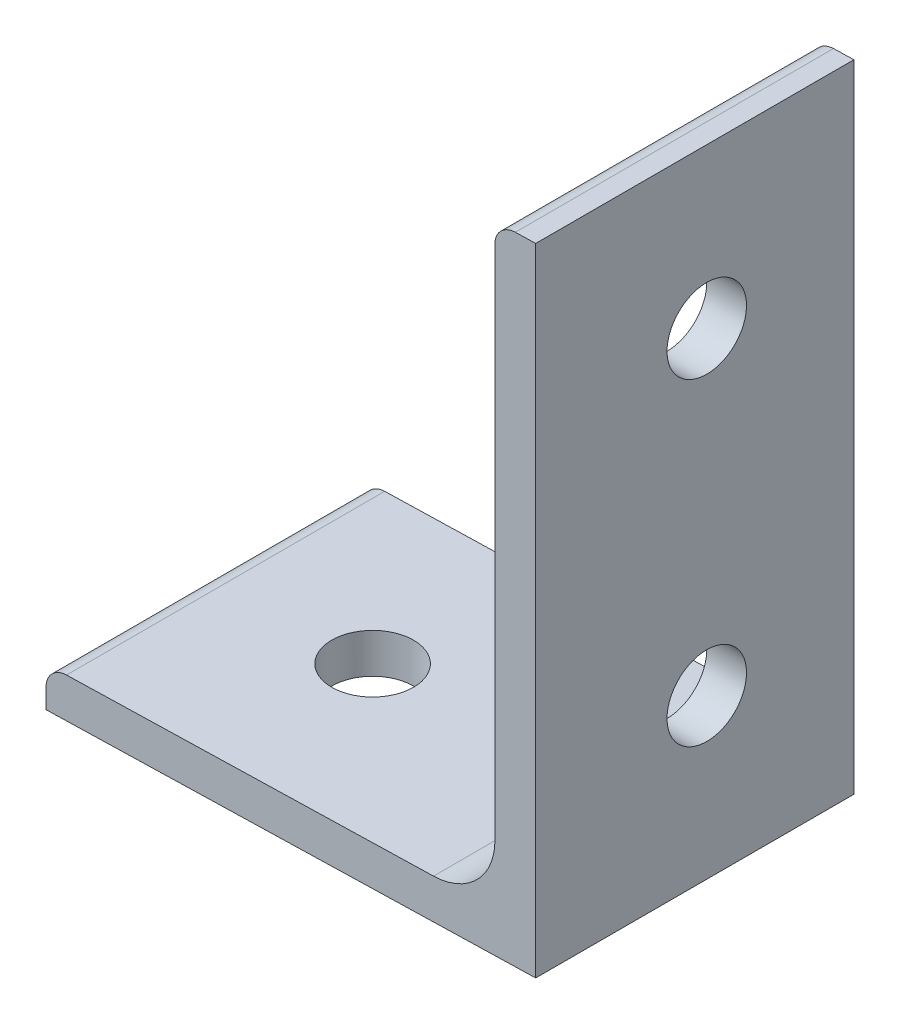
ISO-10303-21;
HEADER;
FILE_DESCRIPTION(('STEP AP214'),'2;1');
FILE_NAME('part.step','',(''),(''),'','','');
FILE_SCHEMA(('AUTOMOTIVE_DESIGN { 1 0 10303 214 1 1 1 1 }'));
ENDSEC;
DATA;
#1=APPLICATION_CONTEXT('core data for automotive mechanical design processes');
#2=APPLICATION_PROTOCOL_DEFINITION('international standard','automotive_design',2000,#1);
#3=PRODUCT_CONTEXT('',#1,'mechanical');
#4=PRODUCT('Part','Part','',(#3));
#5=PRODUCT_RELATED_PRODUCT_CATEGORY('part','',(#4));
#6=PRODUCT_DEFINITION_FORMATION('','',#4);
#7=PRODUCT_DEFINITION_CONTEXT('part definition',#1,'design');
#8=PRODUCT_DEFINITION('design','',#6,#7);
#9=PRODUCT_DEFINITION_SHAPE('','',#8);
#10=(LENGTH_UNIT() NAMED_UNIT(*) SI_UNIT(.MILLI.,.METRE.));
#11=(NAMED_UNIT(*) PLANE_ANGLE_UNIT() SI_UNIT($,.RADIAN.));
#12=(NAMED_UNIT(*) SI_UNIT($,.STERADIAN.) SOLID_ANGLE_UNIT());
#13=UNCERTAINTY_MEASURE_WITH_UNIT(LENGTH_MEASURE(1.E-05),#10,'distance_accuracy_value','');
#14=(GEOMETRIC_REPRESENTATION_CONTEXT(3) GLOBAL_UNCERTAINTY_ASSIGNED_CONTEXT((#13)) GLOBAL_UNIT_ASSIGNED_CONTEXT((#10,
#11,#12)) REPRESENTATION_CONTEXT('',''));
#15=CARTESIAN_POINT('',(0.,0.,0.));
#16=DIRECTION('',(0.,0.,1.));
#17=DIRECTION('',(1.,0.,0.));
#18=AXIS2_PLACEMENT_3D('',#15,#16,#17);
#19=CARTESIAN_POINT('',(11.0998,-17.4498,15.875));
#20=DIRECTION('',(0.,0.,-1.));
#21=DIRECTION('',(-1.,0.,0.));
#22=AXIS2_PLACEMENT_3D('',#19,#20,#21);
#23=CYLINDRICAL_SURFACE('',#22,4.7752);
#24=CARTESIAN_POINT('',(15.875,-17.4498,-7.38948691539076));
#25=CARTESIAN_POINT('',(15.8749607958703,-17.5857111678711,-7.23636728916195));
#26=CARTESIAN_POINT('',(15.8691996849909,-17.7140476477458,-7.07676011712815));
#27=CARTESIAN_POINT('',(15.8497967345363,-17.9544683584301,-6.74636367936128));
#28=CARTESIAN_POINT('',(15.8361614968117,-18.0665661058063,-6.57558388724294));
#29=CARTESIAN_POINT('',(15.8045617726995,-18.2736350085392,-6.22437732001977));
#30=CARTESIAN_POINT('',(15.7865973860279,-18.3686065582862,-6.04395076718932));
#31=CARTESIAN_POINT('',(15.7495425805541,-18.5407600045839,-5.67489280668496));
#32=CARTESIAN_POINT('',(15.7304521193145,-18.6179412301489,-5.48626108986135));
#33=CARTESIAN_POINT('',(15.6967691857035,-18.7436213817966,-5.13128612612312));
#34=CARTESIAN_POINT('',(15.6819325225662,-18.7946903479383,-4.96587074235887));
#35=CARTESIAN_POINT('',(15.6550238870502,-18.8831929373582,-4.63121749717746));
#36=CARTESIAN_POINT('',(15.6429515643681,-18.9206282886737,-4.46198012308084));
#37=CARTESIAN_POINT('',(15.6227910942342,-18.9815035505426,-4.12111181286566));
#38=CARTESIAN_POINT('',(15.61469514375,-19.0049708905553,-3.94948624968054));
#39=CARTESIAN_POINT('',(15.6032507410658,-19.0378086575615,-3.60472523409579));
#40=CARTESIAN_POINT('',(15.5999023688349,-19.0471788470998,-3.43158975631226));
#41=CARTESIAN_POINT('',(15.5982853959638,-19.0517270775053,-3.08510852811338));
#42=CARTESIAN_POINT('',(15.6000167809953,-19.046905158404,-2.91176277829253));
#43=CARTESIAN_POINT('',(15.6083875972335,-19.0231181320052,-2.56616507987638));
#44=CARTESIAN_POINT('',(15.6150271156843,-19.0041527733028,-2.39391315077905));
#45=CARTESIAN_POINT('',(15.6325736391906,-18.9522138991968,-2.05144617658219));
#46=CARTESIAN_POINT('',(15.6434882697233,-18.9192153438454,-1.8812353343889));
#47=CARTESIAN_POINT('',(15.6685023777956,-18.8394888602921,-1.5443108029917));
#48=CARTESIAN_POINT('',(15.6826017995377,-18.7927611726205,-1.37759705257459));
#49=CARTESIAN_POINT('',(15.7124527944421,-18.6863262194501,-1.04994842473229));
#50=CARTESIAN_POINT('',(15.7281908781162,-18.6267211685287,-0.888979051578148));
#51=CARTESIAN_POINT('',(15.7597762892197,-18.494674394576,-0.572372254397139));
#52=CARTESIAN_POINT('',(15.775623634243,-18.4222305554551,-0.416735714382006));
#53=CARTESIAN_POINT('',(15.8055620041383,-18.2651029571149,-0.11208722770826));
#54=CARTESIAN_POINT('',(15.8196573049611,-18.1804501317333,0.036940252604109));
#55=CARTESIAN_POINT('',(15.844163346169,-17.9992544101473,0.327817376701794));
#56=CARTESIAN_POINT('',(15.8545764055646,-17.9027190491873,0.469671489726635));
#57=CARTESIAN_POINT('',(15.8661705537528,-17.7452906054384,0.681961409910588));
#58=CARTESIAN_POINT('',(15.8693951869497,-17.6883913450767,0.755275087871628));
#59=CARTESIAN_POINT('',(15.8738086580742,-17.5714388928702,0.899332815034927));
#60=CARTESIAN_POINT('',(15.8749986832437,-17.5113875614351,0.970078339208201));
#61=CARTESIAN_POINT('',(15.875,-17.4498,1.03948691539076));
#62=B_SPLINE_CURVE_WITH_KNOTS('',3,(#24,#25,#26,#27,#28,#29,#30,#31,#32,#33,#34,#35,#36,#37,#38,
#39,#40,#41,#42,#43,#44,#45,#46,#47,#48,#49,#50,#51,#52,#53,#54,#55,#56,#57,#58,#59,#60,#61),
.UNSPECIFIED.,.F.,.F.,(4,2,2,2,2,2,2,2,2,2,2,2,2,2,2,2,2,2,4),(0.,0.613649372772354,
1.22678499311274,1.83990649206568,2.45305111192113,2.97374489222339,3.49437265248971,
4.01397463607019,4.53358537183239,5.05319464193575,5.57281314850679,6.09336274560457,
6.61390322337106,7.13045448971822,7.64709097337797,8.16244073380394,8.67746535559927,
8.95594344265793,9.23425897565638),.UNSPECIFIED.);
#63=CARTESIAN_POINT('',(15.875,-17.4498,-7.38948691539076));
#64=VERTEX_POINT('',#63);
#65=CARTESIAN_POINT('',(15.875,-17.4498,1.03948691539076));
#66=VERTEX_POINT('',#65);
#67=EDGE_CURVE('E12',#64,#66,#62,.T.);
#68=ORIENTED_EDGE('',*,*,#67,.F.);
#69=DIRECTION('',(0.,0.,-1.));
#70=VECTOR('',#69,1.);
#71=CARTESIAN_POINT('',(15.875,-17.4498,15.875));
#72=LINE('',#71,#70);
#73=CARTESIAN_POINT('',(15.875,-17.4498,-14.8413781368338));
#74=VERTEX_POINT('',#73);
#75=EDGE_CURVE('E128',#64,#74,#72,.T.);
#76=ORIENTED_EDGE('',*,*,#75,.T.);
#77=CARTESIAN_POINT('',(11.0998,-17.4498,-14.7163351241563));
#78=DIRECTION('',(-0.0261769483079492,0.,-0.999657324975555));
#79=DIRECTION('',(0.999657324975555,0.,-0.0261769483079492));
#80=AXIS2_PLACEMENT_3D('',#77,#78,#79);
#81=ELLIPSE('',#80,4.7768369027024,4.7752);
#82=CARTESIAN_POINT('',(11.0998,-22.225,-14.7163351241563));
#83=VERTEX_POINT('',#82);
#84=EDGE_CURVE('E199',#83,#74,#81,.F.);
#85=ORIENTED_EDGE('',*,*,#84,.F.);
#86=DIRECTION('',(0.,0.,-1.));
#87=VECTOR('',#86,1.);
#88=CARTESIAN_POINT('',(11.0998,-22.225,15.875));
#89=LINE('',#88,#87);
#90=CARTESIAN_POINT('',(11.0998,-22.225,10.692371805118));
#91=VERTEX_POINT('',#90);
#92=EDGE_CURVE('E137',#91,#83,#89,.T.);
#93=ORIENTED_EDGE('',*,*,#92,.F.);
#94=CARTESIAN_POINT('',(11.0998,-17.4498,10.692371805118));
#95=DIRECTION('',(0.0261769483079642,0.,0.999657324975555));
#96=DIRECTION('',(0.999657324975555,0.,-0.0261769483079642));
#97=AXIS2_PLACEMENT_3D('',#94,#95,#96);
#98=ELLIPSE('',#97,4.7768369027024,4.7752);
#99=CARTESIAN_POINT('',(15.875,-17.4498,10.5673287924404));
#100=VERTEX_POINT('',#99);
#101=EDGE_CURVE('E205',#100,#91,#98,.F.);
#102=ORIENTED_EDGE('',*,*,#101,.F.);
#103=EDGE_CURVE('E131',#100,#66,#72,.T.);
#104=ORIENTED_EDGE('',*,*,#103,.T.);
#105=EDGE_LOOP('',(#68,#76,#85,#93,#102,#104));
#106=FACE_BOUND('',#105,.T.);
#107=ADVANCED_FACE('F40',(#106),#23,.F.);
#108=CARTESIAN_POINT('',(-19.05,-23.8125,15.875));
#109=DIRECTION('',(1.,0.,0.));
#110=DIRECTION('',(0.,0.,-1.));
#111=AXIS2_PLACEMENT_3D('',#108,#109,#110);
#112=PLANE('',#111);
#113=DIRECTION('',(0.,-1.,0.));
#114=VECTOR('',#113,1.);
#115=CARTESIAN_POINT('',(-19.0500000000003,25.4,11.4818721032475));
#116=LINE('',#115,#114);
#117=CARTESIAN_POINT('',(-19.05,-23.8125,11.4818721032474));
#118=VERTEX_POINT('',#117);
#119=CARTESIAN_POINT('',(-19.0500000000003,-25.4,11.4818721032475));
#120=VERTEX_POINT('',#119);
#121=EDGE_CURVE('E188',#118,#120,#116,.T.);
#122=ORIENTED_EDGE('',*,*,#121,.F.);
#123=DIRECTION('',(0.,0.,-1.));
#124=VECTOR('',#123,1.);
#125=CARTESIAN_POINT('',(-19.05,-23.8125,15.875));
#126=LINE('',#125,#124);
#127=CARTESIAN_POINT('',(-19.05,-23.8125,-13.9268348260273));
#128=VERTEX_POINT('',#127);
#129=EDGE_CURVE('E166',#118,#128,#126,.T.);
#130=ORIENTED_EDGE('',*,*,#129,.T.);
#131=DIRECTION('',(0.,-1.,0.));
#132=VECTOR('',#131,1.);
#133=CARTESIAN_POINT('',(-19.0500000000003,25.4,-13.9268348260273));
#134=LINE('',#133,#132);
#135=CARTESIAN_POINT('',(-19.0500000000003,-25.4,-13.9268348260273));
#136=VERTEX_POINT('',#135);
#137=EDGE_CURVE('E184',#128,#136,#134,.T.);
#138=ORIENTED_EDGE('',*,*,#137,.T.);
#139=DIRECTION('',(0.,0.,-1.));
#140=VECTOR('',#139,1.);
#141=CARTESIAN_POINT('',(-19.05,-25.4,15.875));
#142=LINE('',#141,#140);
#143=EDGE_CURVE('E155',#120,#136,#142,.T.);
#144=ORIENTED_EDGE('',*,*,#143,.F.);
#145=EDGE_LOOP('',(#122,#130,#138,#144));
#146=FACE_BOUND('',#145,.T.);
#147=ADVANCED_FACE('F42',(#146),#112,.F.);
#148=CARTESIAN_POINT('',(-19.05,-25.4,15.875));
#149=DIRECTION('',(0.,1.,0.));
#150=DIRECTION('',(-1.,0.,0.));
#151=AXIS2_PLACEMENT_3D('',#148,#149,#150);
#152=PLANE('',#151);
#153=CARTESIAN_POINT('',(-6.02190472929899,-25.4,-1.56363404234756));
#154=DIRECTION('',(0.,-1.,0.));
#155=DIRECTION('',(0.,0.,-1.));
#156=AXIS2_PLACEMENT_3D('',#153,#154,#155);
#157=CIRCLE('',#156,3.26389999999999);
#158=CARTESIAN_POINT('',(-6.02190472929899,-25.4,-4.82753404234755));
#159=VERTEX_POINT('',#158);
#160=EDGE_CURVE('E124',#159,#159,#157,.T.);
#161=ORIENTED_EDGE('',*,*,#160,.F.);
#162=EDGE_LOOP('',(#161));
#163=FACE_BOUND('',#162,.T.);
#164=DIRECTION('',(-0.999657324975555,0.,0.0261769483079642));
#165=VECTOR('',#164,1.);
#166=CARTESIAN_POINT('',(-19.0500000000003,-25.4,11.4818721032475));
#167=LINE('',#166,#165);
#168=CARTESIAN_POINT('',(19.05,-25.4,10.484188491458));
#169=VERTEX_POINT('',#168);
#170=EDGE_CURVE('E174',#169,#120,#167,.T.);
#171=ORIENTED_EDGE('',*,*,#170,.T.);
#172=ORIENTED_EDGE('',*,*,#143,.T.);
#173=DIRECTION('',(0.999657324975555,0.,-0.0261769483079492));
#174=VECTOR('',#173,1.);
#175=CARTESIAN_POINT('',(-19.0500000000003,-25.4,-13.9268348260273));
#176=LINE('',#175,#174);
#177=CARTESIAN_POINT('',(19.05,-25.4,-14.9245184378162));
#178=VERTEX_POINT('',#177);
#179=EDGE_CURVE('E170',#136,#178,#176,.T.);
#180=ORIENTED_EDGE('',*,*,#179,.T.);
#181=DIRECTION('',(0.,0.,-1.));
#182=VECTOR('',#181,1.);
#183=CARTESIAN_POINT('',(19.05,-25.4,15.875));
#184=LINE('',#183,#182);
#185=EDGE_CURVE('E152',#169,#178,#184,.T.);
#186=ORIENTED_EDGE('',*,*,#185,.F.);
#187=EDGE_LOOP('',(#171,#172,#180,#186));
#188=FACE_BOUND('',#187,.T.);
#189=ADVANCED_FACE('F246',(#163,#188),#152,.F.);
#190=CARTESIAN_POINT('',(19.05,-25.4,15.875));
#191=DIRECTION('',(-1.,0.,0.));
#192=DIRECTION('',(0.,-1.,0.));
#193=AXIS2_PLACEMENT_3D('',#190,#191,#192);
#194=PLANE('',#193);
#195=CARTESIAN_POINT('',(19.05,12.7,-3.175));
#196=DIRECTION('',(1.,0.,0.));
#197=DIRECTION('',(0.,1.,0.));
#198=AXIS2_PLACEMENT_3D('',#195,#196,#197);
#199=CIRCLE('',#198,3.175);
#200=CARTESIAN_POINT('',(19.05,15.875,-3.175));
#201=VERTEX_POINT('',#200);
#202=EDGE_CURVE('E163',#201,#201,#199,.T.);
#203=ORIENTED_EDGE('',*,*,#202,.F.);
#204=EDGE_LOOP('',(#203));
#205=FACE_BOUND('',#204,.T.);
#206=CARTESIAN_POINT('',(19.05,-12.7,-3.175));
#207=DIRECTION('',(1.,0.,0.));
#208=DIRECTION('',(0.,1.,0.));
#209=AXIS2_PLACEMENT_3D('',#206,#207,#208);
#210=CIRCLE('',#209,3.175);
#211=CARTESIAN_POINT('',(19.05,-9.525,-3.175));
#212=VERTEX_POINT('',#211);
#213=EDGE_CURVE('E211',#212,#212,#210,.T.);
#214=ORIENTED_EDGE('',*,*,#213,.F.);
#215=EDGE_LOOP('',(#214));
#216=FACE_BOUND('',#215,.T.);
#217=DIRECTION('',(0.,-1.,0.));
#218=VECTOR('',#217,1.);
#219=CARTESIAN_POINT('',(19.05,25.4,10.484188491458));
#220=LINE('',#219,#218);
#221=CARTESIAN_POINT('',(19.05,25.4,10.484188491458));
#222=VERTEX_POINT('',#221);
#223=EDGE_CURVE('E191',#222,#169,#220,.T.);
#224=ORIENTED_EDGE('',*,*,#223,.T.);
#225=ORIENTED_EDGE('',*,*,#185,.T.);
#226=DIRECTION('',(0.,-1.,0.));
#227=VECTOR('',#226,1.);
#228=CARTESIAN_POINT('',(19.05,25.4,-14.9245184378162));
#229=LINE('',#228,#227);
#230=CARTESIAN_POINT('',(19.05,25.4,-14.9245184378162));
#231=VERTEX_POINT('',#230);
#232=EDGE_CURVE('E194',#231,#178,#229,.T.);
#233=ORIENTED_EDGE('',*,*,#232,.F.);
#234=DIRECTION('',(0.,0.,-1.));
#235=VECTOR('',#234,1.);
#236=CARTESIAN_POINT('',(19.05,25.4,15.875));
#237=LINE('',#236,#235);
#238=EDGE_CURVE('E149',#222,#231,#237,.T.);
#239=ORIENTED_EDGE('',*,*,#238,.F.);
#240=EDGE_LOOP('',(#224,#225,#233,#239));
#241=FACE_BOUND('',#240,.T.);
#242=ADVANCED_FACE('F243',(#205,#216,#241),#194,.F.);
#243=CARTESIAN_POINT('',(17.4625,25.4,15.875));
#244=DIRECTION('',(0.,-1.,0.));
#245=DIRECTION('',(1.,0.,0.));
#246=AXIS2_PLACEMENT_3D('',#243,#244,#245);
#247=PLANE('',#246);
#248=DIRECTION('',(-0.999657324975555,0.,0.0261769483079642));
#249=VECTOR('',#248,1.);
#250=CARTESIAN_POINT('',(-19.0500000000003,25.4,11.4818721032475));
#251=LINE('',#250,#249);
#252=CARTESIAN_POINT('',(17.4625,25.4,10.5257586419492));
#253=VERTEX_POINT('',#252);
#254=EDGE_CURVE('E183',#222,#253,#251,.T.);
#255=ORIENTED_EDGE('',*,*,#254,.F.);
#256=ORIENTED_EDGE('',*,*,#238,.T.);
#257=DIRECTION('',(0.999657324975555,0.,-0.0261769483079492));
#258=VECTOR('',#257,1.);
#259=CARTESIAN_POINT('',(-19.0500000000003,25.4,-13.9268348260273));
#260=LINE('',#259,#258);
#261=CARTESIAN_POINT('',(17.4625,25.4,-14.882948287325));
#262=VERTEX_POINT('',#261);
#263=EDGE_CURVE('E181',#262,#231,#260,.T.);
#264=ORIENTED_EDGE('',*,*,#263,.F.);
#265=DIRECTION('',(0.,0.,-1.));
#266=VECTOR('',#265,1.);
#267=CARTESIAN_POINT('',(17.4625,25.4,15.875));
#268=LINE('',#267,#266);
#269=EDGE_CURVE('E146',#253,#262,#268,.T.);
#270=ORIENTED_EDGE('',*,*,#269,.F.);
#271=EDGE_LOOP('',(#255,#256,#264,#270));
#272=FACE_BOUND('',#271,.T.);
#273=ADVANCED_FACE('F240',(#272),#247,.F.);
#274=CARTESIAN_POINT('',(17.4625,23.8125,15.875));
#275=DIRECTION('',(0.,0.,-1.));
#276=DIRECTION('',(-1.,0.,0.));
#277=AXIS2_PLACEMENT_3D('',#274,#275,#276);
#278=CYLINDRICAL_SURFACE('',#277,1.5875);
#279=CARTESIAN_POINT('',(17.4625,23.8125,10.5257586419492));
#280=DIRECTION('',(0.0261769483079642,0.,0.999657324975555));
#281=DIRECTION('',(0.999657324975555,0.,-0.0261769483079642));
#282=AXIS2_PLACEMENT_3D('',#279,#280,#281);
#283=ELLIPSE('',#282,1.58804418307925,1.5875);
#284=CARTESIAN_POINT('',(15.875,23.8125,10.5673287924404));
#285=VERTEX_POINT('',#284);
#286=EDGE_CURVE('E209',#253,#285,#283,.T.);
#287=ORIENTED_EDGE('',*,*,#286,.F.);
#288=ORIENTED_EDGE('',*,*,#269,.T.);
#289=CARTESIAN_POINT('',(17.4625,23.8125,-14.882948287325));
#290=DIRECTION('',(-0.0261769483079492,0.,-0.999657324975555));
#291=DIRECTION('',(0.999657324975555,0.,-0.0261769483079492));
#292=AXIS2_PLACEMENT_3D('',#289,#290,#291);
#293=ELLIPSE('',#292,1.58804418307925,1.5875);
#294=CARTESIAN_POINT('',(15.875,23.8125,-14.8413781368338));
#295=VERTEX_POINT('',#294);
#296=EDGE_CURVE('E202',#295,#262,#293,.T.);
#297=ORIENTED_EDGE('',*,*,#296,.F.);
#298=DIRECTION('',(0.,0.,-1.));
#299=VECTOR('',#298,1.);
#300=CARTESIAN_POINT('',(15.875,23.8125,15.875));
#301=LINE('',#300,#299);
#302=EDGE_CURVE('E139',#285,#295,#301,.T.);
#303=ORIENTED_EDGE('',*,*,#302,.F.);
#304=EDGE_LOOP('',(#287,#288,#297,#303));
#305=FACE_BOUND('',#304,.T.);
#306=ADVANCED_FACE('F234',(#305),#278,.T.);
#307=CARTESIAN_POINT('',(15.875,23.8125,15.875));
#308=DIRECTION('',(1.,0.,0.));
#309=DIRECTION('',(0.,1.,0.));
#310=AXIS2_PLACEMENT_3D('',#307,#308,#309);
#311=PLANE('',#310);
#312=ORIENTED_EDGE('',*,*,#75,.F.);
#313=CARTESIAN_POINT('',(15.875,-12.7,-3.175));
#314=DIRECTION('',(-1.,0.,0.));
#315=DIRECTION('',(0.,-1.,0.));
#316=AXIS2_PLACEMENT_3D('',#313,#314,#315);
#317=CIRCLE('',#316,6.35);
#318=EDGE_CURVE('E61',#64,#66,#317,.T.);
#319=ORIENTED_EDGE('',*,*,#318,.T.);
#320=ORIENTED_EDGE('',*,*,#103,.F.);
#321=DIRECTION('',(0.,-1.,0.));
#322=VECTOR('',#321,1.);
#323=CARTESIAN_POINT('',(15.875,23.8125,10.5673287924404));
#324=LINE('',#323,#322);
#325=EDGE_CURVE('E207',#285,#100,#324,.T.);
#326=ORIENTED_EDGE('',*,*,#325,.F.);
#327=ORIENTED_EDGE('',*,*,#302,.T.);
#328=DIRECTION('',(0.,1.,0.));
#329=VECTOR('',#328,1.);
#330=CARTESIAN_POINT('',(15.875,23.8125,-14.8413781368338));
#331=LINE('',#330,#329);
#332=EDGE_CURVE('E136',#74,#295,#331,.T.);
#333=ORIENTED_EDGE('',*,*,#332,.F.);
#334=EDGE_LOOP('',(#312,#319,#320,#326,#327,#333));
#335=FACE_BOUND('',#334,.T.);
#336=CARTESIAN_POINT('',(15.875,12.7,-3.175));
#337=DIRECTION('',(1.,0.,0.));
#338=DIRECTION('',(0.,1.,0.));
#339=AXIS2_PLACEMENT_3D('',#336,#337,#338);
#340=CIRCLE('',#339,3.175);
#341=CARTESIAN_POINT('',(15.875,15.875,-3.175));
#342=VERTEX_POINT('',#341);
#343=EDGE_CURVE('E162',#342,#342,#340,.T.);
#344=ORIENTED_EDGE('',*,*,#343,.T.);
#345=EDGE_LOOP('',(#344));
#346=FACE_BOUND('',#345,.T.);
#347=CARTESIAN_POINT('',(15.875,-12.7,-3.175));
#348=DIRECTION('',(1.,0.,0.));
#349=DIRECTION('',(0.,1.,0.));
#350=AXIS2_PLACEMENT_3D('',#347,#348,#349);
#351=CIRCLE('',#350,3.175);
#352=CARTESIAN_POINT('',(15.875,-9.525,-3.175));
#353=VERTEX_POINT('',#352);
#354=EDGE_CURVE('E159',#353,#353,#351,.T.);
#355=ORIENTED_EDGE('',*,*,#354,.T.);
#356=EDGE_LOOP('',(#355));
#357=FACE_BOUND('',#356,.T.);
#358=ADVANCED_FACE('F133',(#335,#346,#357),#311,.F.);
#359=CARTESIAN_POINT('',(11.0998,-22.225,15.875));
#360=DIRECTION('',(0.,-1.,0.));
#361=DIRECTION('',(1.,0.,0.));
#362=AXIS2_PLACEMENT_3D('',#359,#360,#361);
#363=PLANE('',#362);
#364=CARTESIAN_POINT('',(-6.02190472929899,-22.225,-1.56363404234756));
#365=DIRECTION('',(0.,-1.,0.));
#366=DIRECTION('',(1.,0.,0.));
#367=AXIS2_PLACEMENT_3D('',#364,#365,#366);
#368=CIRCLE('',#367,3.26389999999999);
#369=CARTESIAN_POINT('',(-2.758004729299,-22.225,-1.56363404234756));
#370=VERTEX_POINT('',#369);
#371=EDGE_CURVE('E168',#370,#370,#368,.T.);
#372=ORIENTED_EDGE('',*,*,#371,.T.);
#373=EDGE_LOOP('',(#372));
#374=FACE_BOUND('',#373,.T.);
#375=DIRECTION('',(-0.999657324975555,0.,0.0261769483079642));
#376=VECTOR('',#375,1.);
#377=CARTESIAN_POINT('',(10.9641810987841,-22.225,10.6959231110286));
#378=LINE('',#377,#376);
#379=CARTESIAN_POINT('',(-17.4625,-22.225,11.4403019527562));
#380=VERTEX_POINT('',#379);
#381=EDGE_CURVE('E68',#91,#380,#378,.T.);
#382=ORIENTED_EDGE('',*,*,#381,.F.);
#383=ORIENTED_EDGE('',*,*,#92,.T.);
#384=DIRECTION('',(0.999657324975555,0.,-0.0261769483079492));
#385=VECTOR('',#384,1.);
#386=CARTESIAN_POINT('',(10.2992866117621,-22.225,-14.6953729433567));
#387=LINE('',#386,#385);
#388=CARTESIAN_POINT('',(-17.4625,-22.225,-13.9684049765185));
#389=VERTEX_POINT('',#388);
#390=EDGE_CURVE('E190',#389,#83,#387,.T.);
#391=ORIENTED_EDGE('',*,*,#390,.F.);
#392=DIRECTION('',(0.,0.,-1.));
#393=VECTOR('',#392,1.);
#394=CARTESIAN_POINT('',(-17.4625,-22.225,15.875));
#395=LINE('',#394,#393);
#396=EDGE_CURVE('E141',#380,#389,#395,.T.);
#397=ORIENTED_EDGE('',*,*,#396,.F.);
#398=EDGE_LOOP('',(#382,#383,#391,#397));
#399=FACE_BOUND('',#398,.T.);
#400=ADVANCED_FACE('F225',(#374,#399),#363,.F.);
#401=CARTESIAN_POINT('',(-17.4625,-23.8125,15.875));
#402=DIRECTION('',(0.,0.,-1.));
#403=DIRECTION('',(-1.,0.,0.));
#404=AXIS2_PLACEMENT_3D('',#401,#402,#403);
#405=CYLINDRICAL_SURFACE('',#404,1.5875);
#406=CARTESIAN_POINT('',(-17.4625,-23.8125,11.4403019527562));
#407=DIRECTION('',(0.0261769483079642,0.,0.999657324975555));
#408=DIRECTION('',(0.999657324975555,0.,-0.0261769483079642));
#409=AXIS2_PLACEMENT_3D('',#406,#407,#408);
#410=ELLIPSE('',#409,1.58804418307926,1.5875);
#411=EDGE_CURVE('E54',#380,#118,#410,.T.);
#412=ORIENTED_EDGE('',*,*,#411,.F.);
#413=ORIENTED_EDGE('',*,*,#396,.T.);
#414=CARTESIAN_POINT('',(-17.4625,-23.8125,-13.9684049765185));
#415=DIRECTION('',(-0.0261769483079492,0.,-0.999657324975555));
#416=DIRECTION('',(0.999657324975555,0.,-0.0261769483079492));
#417=AXIS2_PLACEMENT_3D('',#414,#415,#416);
#418=ELLIPSE('',#417,1.58804418307925,1.5875);
#419=EDGE_CURVE('E158',#128,#389,#418,.T.);
#420=ORIENTED_EDGE('',*,*,#419,.F.);
#421=ORIENTED_EDGE('',*,*,#129,.F.);
#422=EDGE_LOOP('',(#412,#413,#420,#421));
#423=FACE_BOUND('',#422,.T.);
#424=ADVANCED_FACE('F221',(#423),#405,.T.);
#425=CARTESIAN_POINT('',(-19.05,-12.7,-3.175));
#426=DIRECTION('',(1.,0.,0.));
#427=DIRECTION('',(0.,1.,0.));
#428=AXIS2_PLACEMENT_3D('',#425,#426,#427);
#429=CYLINDRICAL_SURFACE('',#428,3.175);
#430=CARTESIAN_POINT('',(19.05,-9.525,-3.175));
#431=CARTESIAN_POINT('',(19.0169270833333,-9.525,-3.175));
#432=CARTESIAN_POINT('',(18.9838541666667,-9.525,-3.175));
#433=CARTESIAN_POINT('',(18.9177083333333,-9.525,-3.175));
#434=CARTESIAN_POINT('',(18.8846354166667,-9.525,-3.175));
#435=CARTESIAN_POINT('',(18.8184895833333,-9.525,-3.175));
#436=CARTESIAN_POINT('',(18.7854166666667,-9.525,-3.175));
#437=CARTESIAN_POINT('',(18.7192708333333,-9.525,-3.175));
#438=CARTESIAN_POINT('',(18.6861979166667,-9.525,-3.175));
#439=CARTESIAN_POINT('',(18.6200520833333,-9.525,-3.175));
#440=CARTESIAN_POINT('',(18.5869791666667,-9.525,-3.175));
#441=CARTESIAN_POINT('',(18.5208333333333,-9.525,-3.175));
#442=CARTESIAN_POINT('',(18.4877604166667,-9.525,-3.175));
#443=CARTESIAN_POINT('',(18.4216145833333,-9.525,-3.175));
#444=CARTESIAN_POINT('',(18.3885416666667,-9.525,-3.175));
#445=CARTESIAN_POINT('',(18.3223958333333,-9.525,-3.175));
#446=CARTESIAN_POINT('',(18.2893229166667,-9.525,-3.175));
#447=CARTESIAN_POINT('',(18.2231770833333,-9.525,-3.175));
#448=CARTESIAN_POINT('',(18.1901041666667,-9.525,-3.175));
#449=CARTESIAN_POINT('',(18.1239583333333,-9.525,-3.175));
#450=CARTESIAN_POINT('',(18.0908854166667,-9.525,-3.175));
#451=CARTESIAN_POINT('',(18.0247395833333,-9.525,-3.175));
#452=CARTESIAN_POINT('',(17.9916666666667,-9.525,-3.175));
#453=CARTESIAN_POINT('',(17.9255208333333,-9.525,-3.175));
#454=CARTESIAN_POINT('',(17.8924479166667,-9.525,-3.175));
#455=CARTESIAN_POINT('',(17.8263020833333,-9.525,-3.175));
#456=CARTESIAN_POINT('',(17.7932291666667,-9.525,-3.175));
#457=CARTESIAN_POINT('',(17.7270833333333,-9.525,-3.175));
#458=CARTESIAN_POINT('',(17.6940104166667,-9.525,-3.175));
#459=CARTESIAN_POINT('',(17.6278645833333,-9.525,-3.175));
#460=CARTESIAN_POINT('',(17.5947916666667,-9.525,-3.175));
#461=CARTESIAN_POINT('',(17.5286458333333,-9.525,-3.175));
#462=CARTESIAN_POINT('',(17.4955729166667,-9.525,-3.175));
#463=CARTESIAN_POINT('',(17.4294270833333,-9.525,-3.175));
#464=CARTESIAN_POINT('',(17.3963541666667,-9.525,-3.175));
#465=CARTESIAN_POINT('',(17.3302083333333,-9.525,-3.175));
#466=CARTESIAN_POINT('',(17.2971354166667,-9.525,-3.175));
#467=CARTESIAN_POINT('',(17.2309895833333,-9.525,-3.175));
#468=CARTESIAN_POINT('',(17.1979166666667,-9.525,-3.175));
#469=CARTESIAN_POINT('',(17.1317708333333,-9.525,-3.175));
#470=CARTESIAN_POINT('',(17.0986979166667,-9.525,-3.175));
#471=CARTESIAN_POINT('',(17.0325520833333,-9.525,-3.175));
#472=CARTESIAN_POINT('',(16.9994791666667,-9.525,-3.175));
#473=CARTESIAN_POINT('',(16.9333333333333,-9.525,-3.175));
#474=CARTESIAN_POINT('',(16.9002604166667,-9.525,-3.175));
#475=CARTESIAN_POINT('',(16.8341145833333,-9.525,-3.175));
#476=CARTESIAN_POINT('',(16.8010416666667,-9.525,-3.175));
#477=CARTESIAN_POINT('',(16.7348958333333,-9.525,-3.175));
#478=CARTESIAN_POINT('',(16.7018229166667,-9.525,-3.175));
#479=CARTESIAN_POINT('',(16.6356770833333,-9.525,-3.175));
#480=CARTESIAN_POINT('',(16.6026041666667,-9.525,-3.175));
#481=CARTESIAN_POINT('',(16.5364583333333,-9.525,-3.175));
#482=CARTESIAN_POINT('',(16.5033854166667,-9.525,-3.175));
#483=CARTESIAN_POINT('',(16.4372395833333,-9.525,-3.175));
#484=CARTESIAN_POINT('',(16.4041666666667,-9.525,-3.175));
#485=CARTESIAN_POINT('',(16.3380208333333,-9.525,-3.175));
#486=CARTESIAN_POINT('',(16.3049479166667,-9.525,-3.175));
#487=CARTESIAN_POINT('',(16.2388020833333,-9.525,-3.175));
#488=CARTESIAN_POINT('',(16.2057291666667,-9.525,-3.175));
#489=CARTESIAN_POINT('',(16.1395833333333,-9.525,-3.175));
#490=CARTESIAN_POINT('',(16.1065104166667,-9.525,-3.175));
#491=CARTESIAN_POINT('',(16.0403645833333,-9.525,-3.175));
#492=CARTESIAN_POINT('',(16.0072916666667,-9.525,-3.175));
#493=CARTESIAN_POINT('',(15.9411458333333,-9.525,-3.175));
#494=CARTESIAN_POINT('',(15.9080729166667,-9.525,-3.175));
#495=CARTESIAN_POINT('',(15.875,-9.525,-3.175));
#496=B_SPLINE_CURVE_WITH_KNOTS('',3,(#430,#431,#432,#433,#434,#435,#436,#437,#438,#439,#440,
#441,#442,#443,#444,#445,#446,#447,#448,#449,#450,#451,#452,#453,#454,#455,#456,#457,#458,#459,
#460,#461,#462,#463,#464,#465,#466,#467,#468,#469,#470,#471,#472,#473,#474,#475,#476,#477,#478,
#479,#480,#481,#482,#483,#484,#485,#486,#487,#488,#489,#490,#491,#492,#493,#494,#495),
.UNSPECIFIED.,.F.,.F.,(4,2,2,2,2,2,2,2,2,2,2,2,2,2,2,2,2,2,2,2,2,2,2,2,2,2,2,2,2,2,2,2,4),(0.,
0.0992187499999977,0.198437500000002,0.29765625,0.396875000000005,0.496093750000003,0.5953125,
0.694531250000005,0.793750000000003,0.892968750000001,0.992187500000005,1.09140625,1.190625,
1.28984375000001,1.3890625,1.48828125000001,1.58750000000001,1.68671875,1.78593750000001,
1.88515625000001,1.98437500000001,2.08359375000001,2.18281250000001,2.28203125000001,
2.38125000000001,2.48046875000001,2.57968750000001,2.67890625000001,2.77812500000001,
2.87734375000001,2.97656250000001,3.07578125000001,3.17500000000001),.UNSPECIFIED.);
#497=EDGE_CURVE('BSEAM312',#212,#353,#496,.T.);
#498=ORIENTED_EDGE('',*,*,#213,.T.);
#499=ORIENTED_EDGE('',*,*,#354,.F.);
#500=ORIENTED_EDGE('',*,*,#497,.T.);
#501=ORIENTED_EDGE('',*,*,#497,.F.);
#502=EDGE_LOOP('',(#498,#500,#499,#501));
#503=FACE_BOUND('',#502,.T.);
#504=ADVANCED_FACE('F312',(#503),#429,.F.);
#505=CARTESIAN_POINT('',(-19.05,12.7,-3.175));
#506=DIRECTION('',(1.,0.,0.));
#507=DIRECTION('',(0.,1.,0.));
#508=AXIS2_PLACEMENT_3D('',#505,#506,#507);
#509=CYLINDRICAL_SURFACE('',#508,3.175);
#510=CARTESIAN_POINT('',(19.05,15.875,-3.175));
#511=CARTESIAN_POINT('',(19.0169270833333,15.875,-3.175));
#512=CARTESIAN_POINT('',(18.9838541666667,15.875,-3.175));
#513=CARTESIAN_POINT('',(18.9177083333333,15.875,-3.175));
#514=CARTESIAN_POINT('',(18.8846354166667,15.875,-3.175));
#515=CARTESIAN_POINT('',(18.8184895833333,15.875,-3.175));
#516=CARTESIAN_POINT('',(18.7854166666667,15.875,-3.175));
#517=CARTESIAN_POINT('',(18.7192708333333,15.875,-3.175));
#518=CARTESIAN_POINT('',(18.6861979166667,15.875,-3.175));
#519=CARTESIAN_POINT('',(18.6200520833333,15.875,-3.175));
#520=CARTESIAN_POINT('',(18.5869791666667,15.875,-3.175));
#521=CARTESIAN_POINT('',(18.5208333333333,15.875,-3.175));
#522=CARTESIAN_POINT('',(18.4877604166667,15.875,-3.175));
#523=CARTESIAN_POINT('',(18.4216145833333,15.875,-3.175));
#524=CARTESIAN_POINT('',(18.3885416666667,15.875,-3.175));
#525=CARTESIAN_POINT('',(18.3223958333333,15.875,-3.175));
#526=CARTESIAN_POINT('',(18.2893229166667,15.875,-3.175));
#527=CARTESIAN_POINT('',(18.2231770833333,15.875,-3.175));
#528=CARTESIAN_POINT('',(18.1901041666667,15.875,-3.175));
#529=CARTESIAN_POINT('',(18.1239583333333,15.875,-3.175));
#530=CARTESIAN_POINT('',(18.0908854166667,15.875,-3.175));
#531=CARTESIAN_POINT('',(18.0247395833333,15.875,-3.175));
#532=CARTESIAN_POINT('',(17.9916666666667,15.875,-3.175));
#533=CARTESIAN_POINT('',(17.9255208333333,15.875,-3.175));
#534=CARTESIAN_POINT('',(17.8924479166667,15.875,-3.175));
#535=CARTESIAN_POINT('',(17.8263020833333,15.875,-3.175));
#536=CARTESIAN_POINT('',(17.7932291666667,15.875,-3.175));
#537=CARTESIAN_POINT('',(17.7270833333333,15.875,-3.175));
#538=CARTESIAN_POINT('',(17.6940104166667,15.875,-3.175));
#539=CARTESIAN_POINT('',(17.6278645833333,15.875,-3.175));
#540=CARTESIAN_POINT('',(17.5947916666667,15.875,-3.175));
#541=CARTESIAN_POINT('',(17.5286458333333,15.875,-3.175));
#542=CARTESIAN_POINT('',(17.4955729166667,15.875,-3.175));
#543=CARTESIAN_POINT('',(17.4294270833333,15.875,-3.175));
#544=CARTESIAN_POINT('',(17.3963541666667,15.875,-3.175));
#545=CARTESIAN_POINT('',(17.3302083333333,15.875,-3.175));
#546=CARTESIAN_POINT('',(17.2971354166667,15.875,-3.175));
#547=CARTESIAN_POINT('',(17.2309895833333,15.875,-3.175));
#548=CARTESIAN_POINT('',(17.1979166666667,15.875,-3.175));
#549=CARTESIAN_POINT('',(17.1317708333333,15.875,-3.175));
#550=CARTESIAN_POINT('',(17.0986979166667,15.875,-3.175));
#551=CARTESIAN_POINT('',(17.0325520833333,15.875,-3.175));
#552=CARTESIAN_POINT('',(16.9994791666667,15.875,-3.175));
#553=CARTESIAN_POINT('',(16.9333333333333,15.875,-3.175));
#554=CARTESIAN_POINT('',(16.9002604166667,15.875,-3.175));
#555=CARTESIAN_POINT('',(16.8341145833333,15.875,-3.175));
#556=CARTESIAN_POINT('',(16.8010416666667,15.875,-3.175));
#557=CARTESIAN_POINT('',(16.7348958333333,15.875,-3.175));
#558=CARTESIAN_POINT('',(16.7018229166667,15.875,-3.175));
#559=CARTESIAN_POINT('',(16.6356770833333,15.875,-3.175));
#560=CARTESIAN_POINT('',(16.6026041666667,15.875,-3.175));
#561=CARTESIAN_POINT('',(16.5364583333333,15.875,-3.175));
#562=CARTESIAN_POINT('',(16.5033854166667,15.875,-3.175));
#563=CARTESIAN_POINT('',(16.4372395833333,15.875,-3.175));
#564=CARTESIAN_POINT('',(16.4041666666667,15.875,-3.175));
#565=CARTESIAN_POINT('',(16.3380208333333,15.875,-3.175));
#566=CARTESIAN_POINT('',(16.3049479166667,15.875,-3.175));
#567=CARTESIAN_POINT('',(16.2388020833333,15.875,-3.175));
#568=CARTESIAN_POINT('',(16.2057291666667,15.875,-3.175));
#569=CARTESIAN_POINT('',(16.1395833333333,15.875,-3.175));
#570=CARTESIAN_POINT('',(16.1065104166667,15.875,-3.175));
#571=CARTESIAN_POINT('',(16.0403645833333,15.875,-3.175));
#572=CARTESIAN_POINT('',(16.0072916666667,15.875,-3.175));
#573=CARTESIAN_POINT('',(15.9411458333333,15.875,-3.175));
#574=CARTESIAN_POINT('',(15.9080729166667,15.875,-3.175));
#575=CARTESIAN_POINT('',(15.875,15.875,-3.175));
#576=B_SPLINE_CURVE_WITH_KNOTS('',3,(#510,#511,#512,#513,#514,#515,#516,#517,#518,#519,#520,
#521,#522,#523,#524,#525,#526,#527,#528,#529,#530,#531,#532,#533,#534,#535,#536,#537,#538,#539,
#540,#541,#542,#543,#544,#545,#546,#547,#548,#549,#550,#551,#552,#553,#554,#555,#556,#557,#558,
#559,#560,#561,#562,#563,#564,#565,#566,#567,#568,#569,#570,#571,#572,#573,#574,#575),
.UNSPECIFIED.,.F.,.F.,(4,2,2,2,2,2,2,2,2,2,2,2,2,2,2,2,2,2,2,2,2,2,2,2,2,2,2,2,2,2,2,2,4),(0.,
0.0992187499999977,0.198437500000002,0.29765625,0.396874999999998,0.496093750000003,0.5953125,
0.694531249999998,0.793749999999996,0.892968750000001,0.992187499999998,1.09140625,1.190625,
1.28984375,1.3890625,1.48828125,1.5875,1.68671875,1.7859375,1.88515625,1.984375,2.08359375,
2.1828125,2.28203125,2.38125,2.48046875,2.5796875,2.67890624999999,2.778125,2.87734375,
2.97656249999999,3.07578125,3.175),.UNSPECIFIED.);
#577=EDGE_CURVE('BSEAM259',#201,#342,#576,.T.);
#578=ORIENTED_EDGE('',*,*,#202,.T.);
#579=ORIENTED_EDGE('',*,*,#343,.F.);
#580=ORIENTED_EDGE('',*,*,#577,.T.);
#581=ORIENTED_EDGE('',*,*,#577,.F.);
#582=EDGE_LOOP('',(#578,#580,#579,#581));
#583=FACE_BOUND('',#582,.T.);
#584=ADVANCED_FACE('F259',(#583),#509,.F.);
#585=CARTESIAN_POINT('',(-19.0500000000003,25.4,-13.9268348260273));
#586=DIRECTION('',(-0.0261769483079492,0.,-0.999657324975555));
#587=DIRECTION('',(-0.999657324975555,0.,0.0261769483079492));
#588=AXIS2_PLACEMENT_3D('',#585,#586,#587);
#589=PLANE('',#588);
#590=ORIENTED_EDGE('',*,*,#296,.T.);
#591=ORIENTED_EDGE('',*,*,#263,.T.);
#592=ORIENTED_EDGE('',*,*,#232,.T.);
#593=ORIENTED_EDGE('',*,*,#179,.F.);
#594=ORIENTED_EDGE('',*,*,#137,.F.);
#595=ORIENTED_EDGE('',*,*,#419,.T.);
#596=ORIENTED_EDGE('',*,*,#390,.T.);
#597=ORIENTED_EDGE('',*,*,#84,.T.);
#598=ORIENTED_EDGE('',*,*,#332,.T.);
#599=EDGE_LOOP('',(#590,#591,#592,#593,#594,#595,#596,#597,#598));
#600=FACE_BOUND('',#599,.T.);
#601=ADVANCED_FACE('F228',(#600),#589,.T.);
#602=CARTESIAN_POINT('',(-19.0500000000003,25.4,11.4818721032475));
#603=DIRECTION('',(0.0261769483079642,0.,0.999657324975555));
#604=DIRECTION('',(0.999657324975555,0.,-0.0261769483079642));
#605=AXIS2_PLACEMENT_3D('',#602,#603,#604);
#606=PLANE('',#605);
#607=ORIENTED_EDGE('',*,*,#286,.T.);
#608=ORIENTED_EDGE('',*,*,#325,.T.);
#609=ORIENTED_EDGE('',*,*,#101,.T.);
#610=ORIENTED_EDGE('',*,*,#381,.T.);
#611=ORIENTED_EDGE('',*,*,#411,.T.);
#612=ORIENTED_EDGE('',*,*,#121,.T.);
#613=ORIENTED_EDGE('',*,*,#170,.F.);
#614=ORIENTED_EDGE('',*,*,#223,.F.);
#615=ORIENTED_EDGE('',*,*,#254,.T.);
#616=EDGE_LOOP('',(#607,#608,#609,#610,#611,#612,#613,#614,#615));
#617=FACE_BOUND('',#616,.T.);
#618=ADVANCED_FACE('F250',(#617),#606,.T.);
#619=CARTESIAN_POINT('',(-6.02190472929899,-25.4,-1.56363404234756));
#620=DIRECTION('',(0.,-1.,0.));
#621=DIRECTION('',(0.,0.,-1.));
#622=AXIS2_PLACEMENT_3D('',#619,#620,#621);
#623=CYLINDRICAL_SURFACE('',#622,3.26389999999999);
#624=ORIENTED_EDGE('',*,*,#160,.T.);
#625=EDGE_LOOP('',(#624));
#626=FACE_BOUND('',#625,.T.);
#627=ORIENTED_EDGE('',*,*,#371,.F.);
#628=EDGE_LOOP('',(#627));
#629=FACE_BOUND('',#628,.T.);
#630=ADVANCED_FACE('F252',(#626,#629),#623,.F.);
#631=CARTESIAN_POINT('',(13.335,-12.7,-3.175));
#632=DIRECTION('',(1.,0.,0.));
#633=DIRECTION('',(0.,1.,0.));
#634=AXIS2_PLACEMENT_3D('',#631,#632,#633);
#635=CYLINDRICAL_SURFACE('',#634,6.35);
#636=ORIENTED_EDGE('',*,*,#67,.T.);
#637=ORIENTED_EDGE('',*,*,#318,.F.);
#638=EDGE_LOOP('',(#636,#637));
#639=FACE_BOUND('',#638,.T.);
#640=ADVANCED_FACE('F122',(#639),#635,.F.);
#641=CLOSED_SHELL('',(#107,#147,#189,#242,#273,#306,#358,#400,#424,#504,#584,#601,#618,#630,#640));
#642=MANIFOLD_SOLID_BREP('B2',#641);
#643=ADVANCED_BREP_SHAPE_REPRESENTATION('',(#18,#642),#14);
#644=SHAPE_DEFINITION_REPRESENTATION(#9,#643);
ENDSEC;
END-ISO-10303-21;
